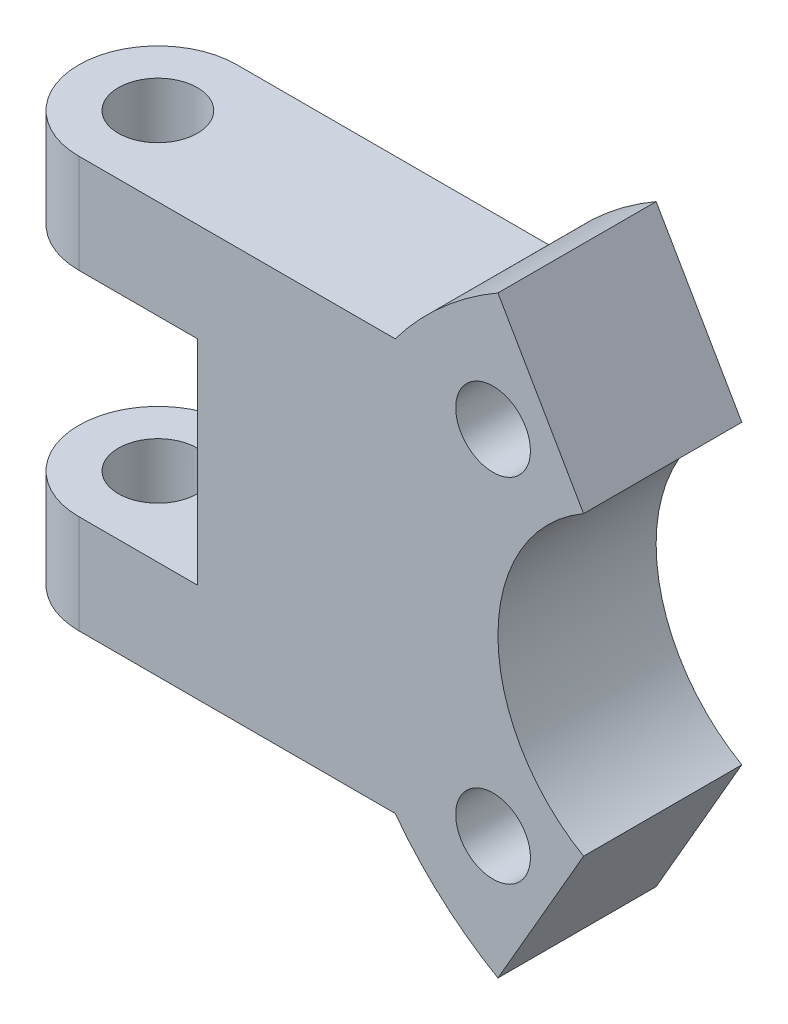
ISO-10303-21;
HEADER;
FILE_DESCRIPTION(('STEP AP214'),'2;1');
FILE_NAME('part.step','',(''),(''),'','','');
FILE_SCHEMA(('AUTOMOTIVE_DESIGN { 1 0 10303 214 1 1 1 1 }'));
ENDSEC;
DATA;
#1=APPLICATION_CONTEXT('core data for automotive mechanical design processes');
#2=APPLICATION_PROTOCOL_DEFINITION('international standard','automotive_design',2000,#1);
#3=PRODUCT_CONTEXT('',#1,'mechanical');
#4=PRODUCT('Part','Part','',(#3));
#5=PRODUCT_RELATED_PRODUCT_CATEGORY('part','',(#4));
#6=PRODUCT_DEFINITION_FORMATION('','',#4);
#7=PRODUCT_DEFINITION_CONTEXT('part definition',#1,'design');
#8=PRODUCT_DEFINITION('design','',#6,#7);
#9=PRODUCT_DEFINITION_SHAPE('','',#8);
#10=(LENGTH_UNIT() NAMED_UNIT(*) SI_UNIT(.MILLI.,.METRE.));
#11=(NAMED_UNIT(*) PLANE_ANGLE_UNIT() SI_UNIT($,.RADIAN.));
#12=(NAMED_UNIT(*) SI_UNIT($,.STERADIAN.) SOLID_ANGLE_UNIT());
#13=UNCERTAINTY_MEASURE_WITH_UNIT(LENGTH_MEASURE(1.E-05),#10,'distance_accuracy_value','');
#14=(GEOMETRIC_REPRESENTATION_CONTEXT(3) GLOBAL_UNCERTAINTY_ASSIGNED_CONTEXT((#13)) GLOBAL_UNIT_ASSIGNED_CONTEXT((#10,
#11,#12)) REPRESENTATION_CONTEXT('',''));
#15=CARTESIAN_POINT('',(0.,0.,0.));
#16=DIRECTION('',(0.,0.,1.));
#17=DIRECTION('',(1.,0.,0.));
#18=AXIS2_PLACEMENT_3D('',#15,#16,#17);
#19=CARTESIAN_POINT('',(0.,0.,10.17));
#20=DIRECTION('',(0.866025403784433,-0.500000000000009,0.));
#21=DIRECTION('',(0.500000000000009,0.866025403784434,0.));
#22=AXIS2_PLACEMENT_3D('',#19,#20,#21);
#23=PLANE('',#22);
#24=DIRECTION('',(0.500000000000009,0.866025403784434,0.));
#25=VECTOR('',#24,1.);
#26=CARTESIAN_POINT('',(0.,0.,10.16));
#27=LINE('',#26,#25);
#28=CARTESIAN_POINT('',(-11.0000000000002,-19.0525588832575,10.16));
#29=VERTEX_POINT('',#28);
#30=CARTESIAN_POINT('',(-5.5000000000001,-9.52627944162877,10.16));
#31=VERTEX_POINT('',#30);
#32=EDGE_CURVE('E144',#29,#31,#27,.T.);
#33=ORIENTED_EDGE('',*,*,#32,.F.);
#34=DIRECTION('',(0.,0.,-1.));
#35=VECTOR('',#34,1.);
#36=CARTESIAN_POINT('',(-11.0000000000002,-19.0525588832575,10.16));
#37=LINE('',#36,#35);
#38=CARTESIAN_POINT('',(-11.0000000000002,-19.0525588832575,0.));
#39=VERTEX_POINT('',#38);
#40=EDGE_CURVE('E152',#29,#39,#37,.T.);
#41=ORIENTED_EDGE('',*,*,#40,.T.);
#42=DIRECTION('',(0.500000000000009,0.866025403784434,0.));
#43=VECTOR('',#42,1.);
#44=CARTESIAN_POINT('',(0.,0.,0.));
#45=LINE('',#44,#43);
#46=CARTESIAN_POINT('',(-5.5000000000001,-9.52627944162877,0.));
#47=VERTEX_POINT('',#46);
#48=EDGE_CURVE('E156',#39,#47,#45,.T.);
#49=ORIENTED_EDGE('',*,*,#48,.T.);
#50=DIRECTION('',(0.,0.,1.));
#51=VECTOR('',#50,1.);
#52=CARTESIAN_POINT('',(-5.5000000000001,-9.52627944162877,0.));
#53=LINE('',#52,#51);
#54=EDGE_CURVE('E135',#47,#31,#53,.T.);
#55=ORIENTED_EDGE('',*,*,#54,.T.);
#56=EDGE_LOOP('',(#33,#41,#49,#55));
#57=FACE_BOUND('',#56,.T.);
#58=ADVANCED_FACE('F35',(#57),#23,.T.);
#59=CARTESIAN_POINT('',(0.,0.,10.16));
#60=DIRECTION('',(0.,0.,-1.));
#61=DIRECTION('',(-1.,0.,0.));
#62=AXIS2_PLACEMENT_3D('',#59,#60,#61);
#63=CYLINDRICAL_SURFACE('',#62,22.);
#64=ORIENTED_EDGE('',*,*,#40,.F.);
#65=CARTESIAN_POINT('',(0.,0.,10.16));
#66=DIRECTION('',(0.,0.,1.));
#67=DIRECTION('',(1.,0.,0.));
#68=AXIS2_PLACEMENT_3D('',#65,#66,#67);
#69=CIRCLE('',#68,22.);
#70=CARTESIAN_POINT('',(-17.6000000000001,-13.1999999999999,10.16));
#71=VERTEX_POINT('',#70);
#72=EDGE_CURVE('E147',#71,#29,#69,.T.);
#73=ORIENTED_EDGE('',*,*,#72,.F.);
#74=DIRECTION('',(0.,0.,1.));
#75=VECTOR('',#74,1.);
#76=CARTESIAN_POINT('',(-17.6000000000001,-13.1999999999999,-36.6349559846878));
#77=LINE('',#76,#75);
#78=CARTESIAN_POINT('',(-17.6000000000001,-13.1999999999999,0.));
#79=VERTEX_POINT('',#78);
#80=EDGE_CURVE('E208',#79,#71,#77,.T.);
#81=ORIENTED_EDGE('',*,*,#80,.F.);
#82=CARTESIAN_POINT('',(0.,0.,0.));
#83=DIRECTION('',(0.,0.,1.));
#84=DIRECTION('',(1.,0.,0.));
#85=AXIS2_PLACEMENT_3D('',#82,#83,#84);
#86=CIRCLE('',#85,22.);
#87=EDGE_CURVE('E163',#79,#39,#86,.T.);
#88=ORIENTED_EDGE('',*,*,#87,.T.);
#89=EDGE_LOOP('',(#64,#73,#81,#88));
#90=FACE_BOUND('',#89,.T.);
#91=ADVANCED_FACE('F275',(#90),#63,.T.);
#92=CARTESIAN_POINT('',(0.,0.,0.));
#93=DIRECTION('',(0.,0.,1.));
#94=DIRECTION('',(1.,0.,0.));
#95=AXIS2_PLACEMENT_3D('',#92,#93,#94);
#96=PLANE('',#95);
#97=CARTESIAN_POINT('',(-11.3137084989848,11.3137084989847,0.));
#98=DIRECTION('',(0.,0.,1.));
#99=DIRECTION('',(1.,0.,0.));
#100=AXIS2_PLACEMENT_3D('',#97,#98,#99);
#101=CIRCLE('',#100,2.4);
#102=CARTESIAN_POINT('',(-8.91370849898478,11.3137084989847,0.));
#103=VERTEX_POINT('',#102);
#104=EDGE_CURVE('E233',#103,#103,#101,.T.);
#105=ORIENTED_EDGE('',*,*,#104,.T.);
#106=EDGE_LOOP('',(#105));
#107=FACE_BOUND('',#106,.T.);
#108=CARTESIAN_POINT('',(-11.3137084989849,-11.3137084989821,0.));
#109=DIRECTION('',(0.,0.,1.));
#110=DIRECTION('',(1.,0.,0.));
#111=AXIS2_PLACEMENT_3D('',#108,#109,#110);
#112=CIRCLE('',#111,2.40000000000074);
#113=CARTESIAN_POINT('',(-8.91370849898413,-11.3137084989821,0.));
#114=VERTEX_POINT('',#113);
#115=EDGE_CURVE('E230',#114,#114,#112,.T.);
#116=ORIENTED_EDGE('',*,*,#115,.T.);
#117=EDGE_LOOP('',(#116));
#118=FACE_BOUND('',#117,.T.);
#119=ORIENTED_EDGE('',*,*,#48,.F.);
#120=ORIENTED_EDGE('',*,*,#87,.F.);
#121=DIRECTION('',(1.,0.,0.));
#122=VECTOR('',#121,1.);
#123=CARTESIAN_POINT('',(-17.6000000000001,-13.1999999999999,0.));
#124=LINE('',#123,#122);
#125=CARTESIAN_POINT('',(-37.9200000000001,-13.2,0.));
#126=VERTEX_POINT('',#125);
#127=EDGE_CURVE('E196',#126,#79,#124,.T.);
#128=ORIENTED_EDGE('',*,*,#127,.F.);
#129=DIRECTION('',(0.,-1.,0.));
#130=VECTOR('',#129,1.);
#131=CARTESIAN_POINT('',(-37.9200000000003,37.267548018407,0.));
#132=LINE('',#131,#130);
#133=CARTESIAN_POINT('',(-37.9200000000001,-6.85,0.));
#134=VERTEX_POINT('',#133);
#135=EDGE_CURVE('E219',#134,#126,#132,.T.);
#136=ORIENTED_EDGE('',*,*,#135,.F.);
#137=DIRECTION('',(-1.,0.,0.));
#138=VECTOR('',#137,1.);
#139=CARTESIAN_POINT('',(-43.0000000000001,-6.85,0.));
#140=LINE('',#139,#138);
#141=CARTESIAN_POINT('',(-30.3000000000001,-6.85,0.));
#142=VERTEX_POINT('',#141);
#143=EDGE_CURVE('E198',#142,#134,#140,.T.);
#144=ORIENTED_EDGE('',*,*,#143,.F.);
#145=DIRECTION('',(0.,-1.,0.));
#146=VECTOR('',#145,1.);
#147=CARTESIAN_POINT('',(-30.3000000000001,-6.85,0.));
#148=LINE('',#147,#146);
#149=CARTESIAN_POINT('',(-30.3000000000001,6.85,0.));
#150=VERTEX_POINT('',#149);
#151=EDGE_CURVE('E202',#150,#142,#148,.T.);
#152=ORIENTED_EDGE('',*,*,#151,.F.);
#153=DIRECTION('',(-1.,0.,0.));
#154=VECTOR('',#153,1.);
#155=CARTESIAN_POINT('',(-43.0000000000001,6.85,0.));
#156=LINE('',#155,#154);
#157=CARTESIAN_POINT('',(-37.9200000000001,6.85,0.));
#158=VERTEX_POINT('',#157);
#159=EDGE_CURVE('E205',#150,#158,#156,.T.);
#160=ORIENTED_EDGE('',*,*,#159,.T.);
#161=CARTESIAN_POINT('',(-37.9200000000002,13.2,0.));
#162=VERTEX_POINT('',#161);
#163=EDGE_CURVE('E217',#162,#158,#132,.T.);
#164=ORIENTED_EDGE('',*,*,#163,.F.);
#165=DIRECTION('',(1.,0.,0.));
#166=VECTOR('',#165,1.);
#167=CARTESIAN_POINT('',(-17.5999999999999,13.2000000000001,0.));
#168=LINE('',#167,#166);
#169=CARTESIAN_POINT('',(-17.5999999999999,13.2000000000001,0.));
#170=VERTEX_POINT('',#169);
#171=EDGE_CURVE('E199',#162,#170,#168,.T.);
#172=ORIENTED_EDGE('',*,*,#171,.T.);
#173=CARTESIAN_POINT('',(-10.9999999999998,19.0525588832577,0.));
#174=VERTEX_POINT('',#173);
#175=EDGE_CURVE('E142',#174,#170,#86,.T.);
#176=ORIENTED_EDGE('',*,*,#175,.F.);
#177=DIRECTION('',(0.499999999999993,-0.866025403784443,0.));
#178=VECTOR('',#177,1.);
#179=CARTESIAN_POINT('',(0.,0.,0.));
#180=LINE('',#179,#178);
#181=CARTESIAN_POINT('',(-5.49999999999992,9.52627944162887,0.));
#182=VERTEX_POINT('',#181);
#183=EDGE_CURVE('E229',#174,#182,#180,.T.);
#184=ORIENTED_EDGE('',*,*,#183,.T.);
#185=CARTESIAN_POINT('',(0.,0.,0.));
#186=DIRECTION('',(0.,0.,1.));
#187=DIRECTION('',(1.,0.,0.));
#188=AXIS2_PLACEMENT_3D('',#185,#186,#187);
#189=CIRCLE('',#188,11.);
#190=EDGE_CURVE('E39',#182,#47,#189,.T.);
#191=ORIENTED_EDGE('',*,*,#190,.T.);
#192=EDGE_LOOP('',(#119,#120,#128,#136,#144,#152,#160,#164,#172,#176,#184,#191));
#193=FACE_BOUND('',#192,.T.);
#194=ADVANCED_FACE('F226',(#107,#118,#193),#96,.F.);
#195=CARTESIAN_POINT('',(0.,0.,10.16));
#196=DIRECTION('',(0.,0.,1.));
#197=DIRECTION('',(1.,0.,0.));
#198=AXIS2_PLACEMENT_3D('',#195,#196,#197);
#199=PLANE('',#198);
#200=CARTESIAN_POINT('',(-11.3137084989848,11.3137084989847,10.16));
#201=DIRECTION('',(0.,0.,1.));
#202=DIRECTION('',(1.,0.,0.));
#203=AXIS2_PLACEMENT_3D('',#200,#201,#202);
#204=CIRCLE('',#203,2.4);
#205=CARTESIAN_POINT('',(-8.91370849898478,11.3137084989847,10.16));
#206=VERTEX_POINT('',#205);
#207=EDGE_CURVE('E238',#206,#206,#204,.T.);
#208=ORIENTED_EDGE('',*,*,#207,.F.);
#209=EDGE_LOOP('',(#208));
#210=FACE_BOUND('',#209,.T.);
#211=CARTESIAN_POINT('',(-11.3137084989849,-11.3137084989821,10.16));
#212=DIRECTION('',(0.,0.,1.));
#213=DIRECTION('',(1.,0.,0.));
#214=AXIS2_PLACEMENT_3D('',#211,#212,#213);
#215=CIRCLE('',#214,2.40000000000074);
#216=CARTESIAN_POINT('',(-8.91370849898413,-11.3137084989821,10.16));
#217=VERTEX_POINT('',#216);
#218=EDGE_CURVE('E141',#217,#217,#215,.T.);
#219=ORIENTED_EDGE('',*,*,#218,.F.);
#220=EDGE_LOOP('',(#219));
#221=FACE_BOUND('',#220,.T.);
#222=ORIENTED_EDGE('',*,*,#72,.T.);
#223=ORIENTED_EDGE('',*,*,#32,.T.);
#224=CARTESIAN_POINT('',(0.,0.,10.16));
#225=DIRECTION('',(0.,0.,1.));
#226=DIRECTION('',(1.,0.,0.));
#227=AXIS2_PLACEMENT_3D('',#224,#225,#226);
#228=CIRCLE('',#227,11.);
#229=CARTESIAN_POINT('',(-5.49999999999992,9.52627944162887,10.16));
#230=VERTEX_POINT('',#229);
#231=EDGE_CURVE('E131',#230,#31,#228,.T.);
#232=ORIENTED_EDGE('',*,*,#231,.F.);
#233=DIRECTION('',(0.499999999999993,-0.866025403784443,0.));
#234=VECTOR('',#233,1.);
#235=CARTESIAN_POINT('',(0.,0.,10.16));
#236=LINE('',#235,#234);
#237=CARTESIAN_POINT('',(-10.9999999999998,19.0525588832577,10.16));
#238=VERTEX_POINT('',#237);
#239=EDGE_CURVE('E151',#238,#230,#236,.T.);
#240=ORIENTED_EDGE('',*,*,#239,.F.);
#241=CARTESIAN_POINT('',(-17.5999999999999,13.2000000000001,10.16));
#242=VERTEX_POINT('',#241);
#243=EDGE_CURVE('E162',#238,#242,#69,.T.);
#244=ORIENTED_EDGE('',*,*,#243,.T.);
#245=DIRECTION('',(-1.,0.,0.));
#246=VECTOR('',#245,1.);
#247=CARTESIAN_POINT('',(-17.5999999999999,13.2000000000001,10.16));
#248=LINE('',#247,#246);
#249=CARTESIAN_POINT('',(-37.9200000000002,13.2,10.16));
#250=VERTEX_POINT('',#249);
#251=EDGE_CURVE('E171',#242,#250,#248,.T.);
#252=ORIENTED_EDGE('',*,*,#251,.T.);
#253=DIRECTION('',(0.,-1.,0.));
#254=VECTOR('',#253,1.);
#255=CARTESIAN_POINT('',(-37.9200000000003,37.267548018407,10.16));
#256=LINE('',#255,#254);
#257=CARTESIAN_POINT('',(-37.9200000000002,6.85,10.16));
#258=VERTEX_POINT('',#257);
#259=EDGE_CURVE('E221',#250,#258,#256,.T.);
#260=ORIENTED_EDGE('',*,*,#259,.T.);
#261=DIRECTION('',(1.,0.,0.));
#262=VECTOR('',#261,1.);
#263=CARTESIAN_POINT('',(-43.0000000000001,6.85,10.16));
#264=LINE('',#263,#262);
#265=CARTESIAN_POINT('',(-30.3000000000001,6.85,10.16));
#266=VERTEX_POINT('',#265);
#267=EDGE_CURVE('E183',#258,#266,#264,.T.);
#268=ORIENTED_EDGE('',*,*,#267,.T.);
#269=DIRECTION('',(0.,1.,0.));
#270=VECTOR('',#269,1.);
#271=CARTESIAN_POINT('',(-30.3000000000001,-6.85,10.16));
#272=LINE('',#271,#270);
#273=CARTESIAN_POINT('',(-30.3000000000001,-6.85,10.16));
#274=VERTEX_POINT('',#273);
#275=EDGE_CURVE('E185',#274,#266,#272,.T.);
#276=ORIENTED_EDGE('',*,*,#275,.F.);
#277=DIRECTION('',(1.,0.,0.));
#278=VECTOR('',#277,1.);
#279=CARTESIAN_POINT('',(-43.0000000000001,-6.85,10.16));
#280=LINE('',#279,#278);
#281=CARTESIAN_POINT('',(-37.9200000000001,-6.85,10.16));
#282=VERTEX_POINT('',#281);
#283=EDGE_CURVE('E191',#282,#274,#280,.T.);
#284=ORIENTED_EDGE('',*,*,#283,.F.);
#285=CARTESIAN_POINT('',(-37.9200000000001,-13.2,10.16));
#286=VERTEX_POINT('',#285);
#287=EDGE_CURVE('E220',#282,#286,#256,.T.);
#288=ORIENTED_EDGE('',*,*,#287,.T.);
#289=DIRECTION('',(-1.,0.,0.));
#290=VECTOR('',#289,1.);
#291=CARTESIAN_POINT('',(-17.6000000000001,-13.1999999999999,10.16));
#292=LINE('',#291,#290);
#293=EDGE_CURVE('E193',#71,#286,#292,.T.);
#294=ORIENTED_EDGE('',*,*,#293,.F.);
#295=EDGE_LOOP('',(#222,#223,#232,#240,#244,#252,#260,#268,#276,#284,#288,#294));
#296=FACE_BOUND('',#295,.T.);
#297=ADVANCED_FACE('F145',(#210,#221,#296),#199,.T.);
#298=CARTESIAN_POINT('',(0.,0.,0.));
#299=DIRECTION('',(0.,0.,1.));
#300=DIRECTION('',(1.,0.,0.));
#301=AXIS2_PLACEMENT_3D('',#298,#299,#300);
#302=CYLINDRICAL_SURFACE('',#301,11.);
#303=ORIENTED_EDGE('',*,*,#54,.F.);
#304=ORIENTED_EDGE('',*,*,#190,.F.);
#305=DIRECTION('',(0.,0.,1.));
#306=VECTOR('',#305,1.);
#307=CARTESIAN_POINT('',(-5.49999999999992,9.52627944162887,0.));
#308=LINE('',#307,#306);
#309=EDGE_CURVE('E137',#182,#230,#308,.T.);
#310=ORIENTED_EDGE('',*,*,#309,.T.);
#311=ORIENTED_EDGE('',*,*,#231,.T.);
#312=EDGE_LOOP('',(#303,#304,#310,#311));
#313=FACE_BOUND('',#312,.T.);
#314=ADVANCED_FACE('F37',(#313),#302,.F.);
#315=CARTESIAN_POINT('',(0.,0.,10.17));
#316=DIRECTION('',(-0.866025403784443,-0.499999999999993,0.));
#317=DIRECTION('',(0.499999999999993,-0.866025403784443,0.));
#318=AXIS2_PLACEMENT_3D('',#315,#316,#317);
#319=PLANE('',#318);
#320=ORIENTED_EDGE('',*,*,#239,.T.);
#321=ORIENTED_EDGE('',*,*,#309,.F.);
#322=ORIENTED_EDGE('',*,*,#183,.F.);
#323=DIRECTION('',(0.,0.,-1.));
#324=VECTOR('',#323,1.);
#325=CARTESIAN_POINT('',(-10.9999999999998,19.0525588832577,10.16));
#326=LINE('',#325,#324);
#327=EDGE_CURVE('E443',#238,#174,#326,.T.);
#328=ORIENTED_EDGE('',*,*,#327,.F.);
#329=EDGE_LOOP('',(#320,#321,#322,#328));
#330=FACE_BOUND('',#329,.T.);
#331=ADVANCED_FACE('F286',(#330),#319,.F.);
#332=CARTESIAN_POINT('',(-37.9200000000003,37.267548018407,5.08));
#333=DIRECTION('',(0.,-1.,0.));
#334=DIRECTION('',(1.,0.,0.));
#335=AXIS2_PLACEMENT_3D('',#332,#333,#334);
#336=CYLINDRICAL_SURFACE('',#335,2.54);
#337=CARTESIAN_POINT('',(-37.9200000000001,-13.2,5.08));
#338=DIRECTION('',(0.,-1.,0.));
#339=DIRECTION('',(1.,0.,0.));
#340=AXIS2_PLACEMENT_3D('',#337,#338,#339);
#341=CIRCLE('',#340,2.54);
#342=CARTESIAN_POINT('',(-35.3800000000001,-13.2,5.08));
#343=VERTEX_POINT('',#342);
#344=EDGE_CURVE('E45',#343,#343,#341,.T.);
#345=ORIENTED_EDGE('',*,*,#344,.T.);
#346=EDGE_LOOP('',(#345));
#347=FACE_BOUND('',#346,.T.);
#348=CARTESIAN_POINT('',(-37.9200000000001,-6.85,5.08));
#349=DIRECTION('',(0.,-1.,0.));
#350=DIRECTION('',(0.,0.,-1.));
#351=AXIS2_PLACEMENT_3D('',#348,#349,#350);
#352=CIRCLE('',#351,2.54);
#353=CARTESIAN_POINT('',(-37.9200000000001,-6.85,2.54));
#354=VERTEX_POINT('',#353);
#355=EDGE_CURVE('E195',#354,#354,#352,.T.);
#356=ORIENTED_EDGE('',*,*,#355,.F.);
#357=EDGE_LOOP('',(#356));
#358=FACE_BOUND('',#357,.T.);
#359=ADVANCED_FACE('F268',(#347,#358),#336,.F.);
#360=CARTESIAN_POINT('',(-37.9200000000002,6.85,5.08));
#361=DIRECTION('',(0.,-1.,0.));
#362=DIRECTION('',(0.,0.,-1.));
#363=AXIS2_PLACEMENT_3D('',#360,#361,#362);
#364=CIRCLE('',#363,2.54);
#365=CARTESIAN_POINT('',(-37.9200000000002,6.85,2.54));
#366=VERTEX_POINT('',#365);
#367=EDGE_CURVE('E211',#366,#366,#364,.T.);
#368=ORIENTED_EDGE('',*,*,#367,.T.);
#369=EDGE_LOOP('',(#368));
#370=FACE_BOUND('',#369,.T.);
#371=CARTESIAN_POINT('',(-37.9200000000002,13.2,5.08));
#372=DIRECTION('',(0.,1.,0.));
#373=DIRECTION('',(-1.,0.,0.));
#374=AXIS2_PLACEMENT_3D('',#371,#372,#373);
#375=CIRCLE('',#374,2.54);
#376=CARTESIAN_POINT('',(-40.4600000000002,13.2,5.08));
#377=VERTEX_POINT('',#376);
#378=EDGE_CURVE('E11',#377,#377,#375,.F.);
#379=ORIENTED_EDGE('',*,*,#378,.F.);
#380=EDGE_LOOP('',(#379));
#381=FACE_BOUND('',#380,.T.);
#382=ADVANCED_FACE('F259',(#370,#381),#336,.F.);
#383=CARTESIAN_POINT('',(-37.9200000000003,37.267548018407,5.08));
#384=DIRECTION('',(0.,-1.,0.));
#385=DIRECTION('',(1.,0.,0.));
#386=AXIS2_PLACEMENT_3D('',#383,#384,#385);
#387=CYLINDRICAL_SURFACE('',#386,5.08);
#388=ORIENTED_EDGE('',*,*,#259,.F.);
#389=CARTESIAN_POINT('',(-37.9200000000002,13.2,5.08));
#390=DIRECTION('',(0.,1.,0.));
#391=DIRECTION('',(-1.,0.,0.));
#392=AXIS2_PLACEMENT_3D('',#389,#390,#391);
#393=CIRCLE('',#392,5.08);
#394=EDGE_CURVE('E68',#162,#250,#393,.T.);
#395=ORIENTED_EDGE('',*,*,#394,.F.);
#396=ORIENTED_EDGE('',*,*,#163,.T.);
#397=CARTESIAN_POINT('',(-37.9200000000002,6.85,5.08));
#398=DIRECTION('',(0.,-1.,0.));
#399=DIRECTION('',(0.,0.,-1.));
#400=AXIS2_PLACEMENT_3D('',#397,#398,#399);
#401=CIRCLE('',#400,5.08);
#402=EDGE_CURVE('E73',#258,#158,#401,.T.);
#403=ORIENTED_EDGE('',*,*,#402,.F.);
#404=EDGE_LOOP('',(#388,#395,#396,#403));
#405=FACE_BOUND('',#404,.T.);
#406=ADVANCED_FACE('F257',(#405),#387,.T.);
#407=CARTESIAN_POINT('',(-43.0000000000001,6.85,-36.6349559846878));
#408=DIRECTION('',(0.,-1.,0.));
#409=DIRECTION('',(0.,0.,-1.));
#410=AXIS2_PLACEMENT_3D('',#407,#408,#409);
#411=PLANE('',#410);
#412=ORIENTED_EDGE('',*,*,#367,.F.);
#413=EDGE_LOOP('',(#412));
#414=FACE_BOUND('',#413,.T.);
#415=ORIENTED_EDGE('',*,*,#267,.F.);
#416=ORIENTED_EDGE('',*,*,#402,.T.);
#417=ORIENTED_EDGE('',*,*,#159,.F.);
#418=DIRECTION('',(0.,0.,1.));
#419=VECTOR('',#418,1.);
#420=CARTESIAN_POINT('',(-30.3000000000001,6.85,-36.6349559846878));
#421=LINE('',#420,#419);
#422=EDGE_CURVE('E180',#150,#266,#421,.T.);
#423=ORIENTED_EDGE('',*,*,#422,.T.);
#424=EDGE_LOOP('',(#415,#416,#417,#423));
#425=FACE_BOUND('',#424,.T.);
#426=ADVANCED_FACE('F251',(#414,#425),#411,.T.);
#427=CARTESIAN_POINT('',(-30.3000000000001,-6.85,-36.6349559846878));
#428=DIRECTION('',(1.,0.,0.));
#429=DIRECTION('',(0.,0.,-1.));
#430=AXIS2_PLACEMENT_3D('',#427,#428,#429);
#431=PLANE('',#430);
#432=ORIENTED_EDGE('',*,*,#422,.F.);
#433=ORIENTED_EDGE('',*,*,#151,.T.);
#434=DIRECTION('',(0.,0.,1.));
#435=VECTOR('',#434,1.);
#436=CARTESIAN_POINT('',(-30.3000000000001,-6.85,-36.6349559846878));
#437=LINE('',#436,#435);
#438=EDGE_CURVE('E244',#142,#274,#437,.T.);
#439=ORIENTED_EDGE('',*,*,#438,.T.);
#440=ORIENTED_EDGE('',*,*,#275,.T.);
#441=EDGE_LOOP('',(#432,#433,#439,#440));
#442=FACE_BOUND('',#441,.T.);
#443=ADVANCED_FACE('F254',(#442),#431,.F.);
#444=CARTESIAN_POINT('',(-43.0000000000001,-6.85,-36.6349559846878));
#445=DIRECTION('',(0.,-1.,0.));
#446=DIRECTION('',(0.,0.,-1.));
#447=AXIS2_PLACEMENT_3D('',#444,#445,#446);
#448=PLANE('',#447);
#449=ORIENTED_EDGE('',*,*,#355,.T.);
#450=EDGE_LOOP('',(#449));
#451=FACE_BOUND('',#450,.T.);
#452=CARTESIAN_POINT('',(-37.9200000000001,-6.85,5.08));
#453=DIRECTION('',(0.,-1.,0.));
#454=DIRECTION('',(0.,0.,-1.));
#455=AXIS2_PLACEMENT_3D('',#452,#453,#454);
#456=CIRCLE('',#455,5.08);
#457=EDGE_CURVE('E214',#282,#134,#456,.T.);
#458=ORIENTED_EDGE('',*,*,#457,.F.);
#459=ORIENTED_EDGE('',*,*,#283,.T.);
#460=ORIENTED_EDGE('',*,*,#438,.F.);
#461=ORIENTED_EDGE('',*,*,#143,.T.);
#462=EDGE_LOOP('',(#458,#459,#460,#461));
#463=FACE_BOUND('',#462,.T.);
#464=ADVANCED_FACE('F274',(#451,#463),#448,.F.);
#465=ORIENTED_EDGE('',*,*,#457,.T.);
#466=ORIENTED_EDGE('',*,*,#135,.T.);
#467=CARTESIAN_POINT('',(-37.9200000000001,-13.2,5.08));
#468=DIRECTION('',(0.,-1.,0.));
#469=DIRECTION('',(1.,0.,0.));
#470=AXIS2_PLACEMENT_3D('',#467,#468,#469);
#471=CIRCLE('',#470,5.08);
#472=EDGE_CURVE('E53',#286,#126,#471,.T.);
#473=ORIENTED_EDGE('',*,*,#472,.F.);
#474=ORIENTED_EDGE('',*,*,#287,.F.);
#475=EDGE_LOOP('',(#465,#466,#473,#474));
#476=FACE_BOUND('',#475,.T.);
#477=ADVANCED_FACE('F261',(#476),#387,.T.);
#478=CARTESIAN_POINT('',(-17.6000000000001,-13.1999999999999,-36.6349559846878));
#479=DIRECTION('',(0.,1.,0.));
#480=DIRECTION('',(-1.,0.,0.));
#481=AXIS2_PLACEMENT_3D('',#478,#479,#480);
#482=PLANE('',#481);
#483=ORIENTED_EDGE('',*,*,#344,.F.);
#484=EDGE_LOOP('',(#483));
#485=FACE_BOUND('',#484,.T.);
#486=ORIENTED_EDGE('',*,*,#472,.T.);
#487=ORIENTED_EDGE('',*,*,#127,.T.);
#488=ORIENTED_EDGE('',*,*,#80,.T.);
#489=ORIENTED_EDGE('',*,*,#293,.T.);
#490=EDGE_LOOP('',(#486,#487,#488,#489));
#491=FACE_BOUND('',#490,.T.);
#492=ADVANCED_FACE('F273',(#485,#491),#482,.F.);
#493=CARTESIAN_POINT('',(-11.3137084989848,11.3137084989847,0.));
#494=DIRECTION('',(0.,0.,1.));
#495=DIRECTION('',(1.,0.,0.));
#496=AXIS2_PLACEMENT_3D('',#493,#494,#495);
#497=CYLINDRICAL_SURFACE('',#496,2.4);
#498=ORIENTED_EDGE('',*,*,#207,.T.);
#499=EDGE_LOOP('',(#498));
#500=FACE_BOUND('',#499,.T.);
#501=ORIENTED_EDGE('',*,*,#104,.F.);
#502=EDGE_LOOP('',(#501));
#503=FACE_BOUND('',#502,.T.);
#504=ADVANCED_FACE('F301',(#500,#503),#497,.F.);
#505=CARTESIAN_POINT('',(-11.3137084989849,-11.3137084989821,0.));
#506=DIRECTION('',(0.,0.,1.));
#507=DIRECTION('',(1.,0.,0.));
#508=AXIS2_PLACEMENT_3D('',#505,#506,#507);
#509=CYLINDRICAL_SURFACE('',#508,2.40000000000074);
#510=ORIENTED_EDGE('',*,*,#218,.T.);
#511=EDGE_LOOP('',(#510));
#512=FACE_BOUND('',#511,.T.);
#513=ORIENTED_EDGE('',*,*,#115,.F.);
#514=EDGE_LOOP('',(#513));
#515=FACE_BOUND('',#514,.T.);
#516=ADVANCED_FACE('F290',(#512,#515),#509,.F.);
#517=CARTESIAN_POINT('',(-17.5999999999999,13.2000000000001,-36.6349559846878));
#518=DIRECTION('',(0.,1.,0.));
#519=DIRECTION('',(-1.,0.,0.));
#520=AXIS2_PLACEMENT_3D('',#517,#518,#519);
#521=PLANE('',#520);
#522=ORIENTED_EDGE('',*,*,#378,.T.);
#523=EDGE_LOOP('',(#522));
#524=FACE_BOUND('',#523,.T.);
#525=ORIENTED_EDGE('',*,*,#394,.T.);
#526=ORIENTED_EDGE('',*,*,#251,.F.);
#527=DIRECTION('',(0.,0.,1.));
#528=VECTOR('',#527,1.);
#529=CARTESIAN_POINT('',(-17.5999999999999,13.2000000000001,-36.6349559846878));
#530=LINE('',#529,#528);
#531=EDGE_CURVE('E174',#170,#242,#530,.T.);
#532=ORIENTED_EDGE('',*,*,#531,.F.);
#533=ORIENTED_EDGE('',*,*,#171,.F.);
#534=EDGE_LOOP('',(#525,#526,#532,#533));
#535=FACE_BOUND('',#534,.T.);
#536=ADVANCED_FACE('F182',(#524,#535),#521,.T.);
#537=ORIENTED_EDGE('',*,*,#243,.F.);
#538=ORIENTED_EDGE('',*,*,#327,.T.);
#539=ORIENTED_EDGE('',*,*,#175,.T.);
#540=ORIENTED_EDGE('',*,*,#531,.T.);
#541=EDGE_LOOP('',(#537,#538,#539,#540));
#542=FACE_BOUND('',#541,.T.);
#543=ADVANCED_FACE('F175',(#542),#63,.T.);
#544=CLOSED_SHELL('',(#58,#91,#194,#297,#314,#331,#359,#382,#406,#426,#443,#464,#477,#492,#504,
#516,#536,#543));
#545=MANIFOLD_SOLID_BREP('B2',#544);
#546=ADVANCED_BREP_SHAPE_REPRESENTATION('',(#18,#545),#14);
#547=SHAPE_DEFINITION_REPRESENTATION(#9,#546);
ENDSEC;
END-ISO-10303-21;
